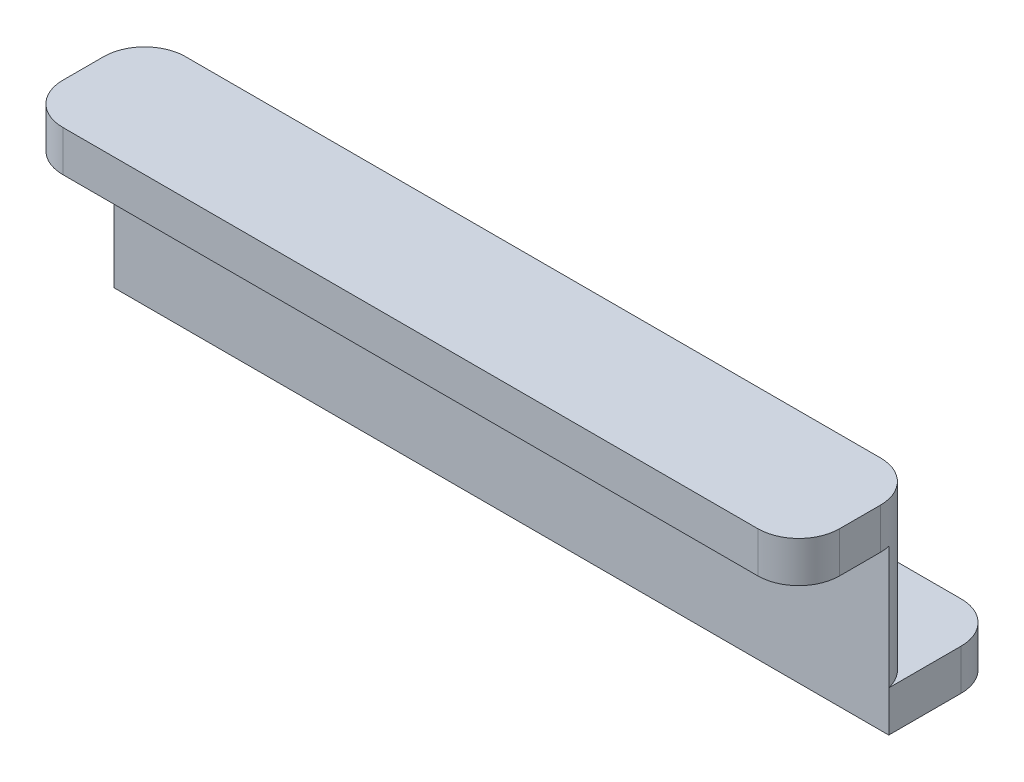
ISO-10303-21;
HEADER;
FILE_DESCRIPTION(('STEP AP214'),'2;1');
FILE_NAME('part.step','',(''),(''),'','','');
FILE_SCHEMA(('AUTOMOTIVE_DESIGN { 1 0 10303 214 1 1 1 1 }'));
ENDSEC;
DATA;
#1=APPLICATION_CONTEXT('core data for automotive mechanical design processes');
#2=APPLICATION_PROTOCOL_DEFINITION('international standard','automotive_design',2000,#1);
#3=PRODUCT_CONTEXT('',#1,'mechanical');
#4=PRODUCT('Part','Part','',(#3));
#5=PRODUCT_RELATED_PRODUCT_CATEGORY('part','',(#4));
#6=PRODUCT_DEFINITION_FORMATION('','',#4);
#7=PRODUCT_DEFINITION_CONTEXT('part definition',#1,'design');
#8=PRODUCT_DEFINITION('design','',#6,#7);
#9=PRODUCT_DEFINITION_SHAPE('','',#8);
#10=(LENGTH_UNIT() NAMED_UNIT(*) SI_UNIT(.MILLI.,.METRE.));
#11=(NAMED_UNIT(*) PLANE_ANGLE_UNIT() SI_UNIT($,.RADIAN.));
#12=(NAMED_UNIT(*) SI_UNIT($,.STERADIAN.) SOLID_ANGLE_UNIT());
#13=UNCERTAINTY_MEASURE_WITH_UNIT(LENGTH_MEASURE(1.E-05),#10,'distance_accuracy_value','');
#14=(GEOMETRIC_REPRESENTATION_CONTEXT(3) GLOBAL_UNCERTAINTY_ASSIGNED_CONTEXT((#13)) GLOBAL_UNIT_ASSIGNED_CONTEXT((#10,
#11,#12)) REPRESENTATION_CONTEXT('',''));
#15=CARTESIAN_POINT('',(0.,0.,0.));
#16=DIRECTION('',(0.,0.,1.));
#17=DIRECTION('',(1.,0.,0.));
#18=AXIS2_PLACEMENT_3D('',#15,#16,#17);
#19=CARTESIAN_POINT('',(17.,2.,-1.));
#20=DIRECTION('',(0.,-1.,0.));
#21=DIRECTION('',(0.,0.,-1.));
#22=AXIS2_PLACEMENT_3D('',#19,#20,#21);
#23=CYLINDRICAL_SURFACE('',#22,2.);
#24=CARTESIAN_POINT('',(17.0000000000001,-5.99999999999988,-1.00000000000002));
#25=DIRECTION('',(0.,1.,0.));
#26=DIRECTION('',(1.,0.,0.));
#27=AXIS2_PLACEMENT_3D('',#24,#25,#26);
#28=CIRCLE('',#27,2.);
#29=CARTESIAN_POINT('',(18.946893713898,-6.,-1.45782624082115));
#30=VERTEX_POINT('',#29);
#31=CARTESIAN_POINT('',(17.,-5.99999999999999,-3.00000000000001));
#32=VERTEX_POINT('',#31);
#33=EDGE_CURVE('E47',#30,#32,#28,.T.);
#34=ORIENTED_EDGE('',*,*,#33,.T.);
#35=DIRECTION('',(0.,-1.,0.));
#36=VECTOR('',#35,1.);
#37=CARTESIAN_POINT('',(17.,2.,-3.00000000000001));
#38=LINE('',#37,#36);
#39=CARTESIAN_POINT('',(17.,2.,-3.00000000000001));
#40=VERTEX_POINT('',#39);
#41=EDGE_CURVE('E40',#40,#32,#38,.T.);
#42=ORIENTED_EDGE('',*,*,#41,.F.);
#43=CARTESIAN_POINT('',(17.,2.,-1.));
#44=DIRECTION('',(0.,1.,0.));
#45=DIRECTION('',(0.,0.,-1.));
#46=AXIS2_PLACEMENT_3D('',#43,#44,#45);
#47=CIRCLE('',#46,2.);
#48=CARTESIAN_POINT('',(19.,2.,-1.));
#49=VERTEX_POINT('',#48);
#50=EDGE_CURVE('E205',#49,#40,#47,.T.);
#51=ORIENTED_EDGE('',*,*,#50,.F.);
#52=DIRECTION('',(0.,-1.,0.));
#53=VECTOR('',#52,1.);
#54=CARTESIAN_POINT('',(19.,2.,-1.));
#55=LINE('',#54,#53);
#56=CARTESIAN_POINT('',(19.,0.,-1.));
#57=VERTEX_POINT('',#56);
#58=EDGE_CURVE('E222',#49,#57,#55,.T.);
#59=ORIENTED_EDGE('',*,*,#58,.T.);
#60=CARTESIAN_POINT('',(17.,0.,-1.));
#61=DIRECTION('',(0.,1.,0.));
#62=DIRECTION('',(0.,0.,-1.));
#63=AXIS2_PLACEMENT_3D('',#60,#61,#62);
#64=CIRCLE('',#63,2.);
#65=CARTESIAN_POINT('',(18.946893713898,0.,-1.45782624082115));
#66=VERTEX_POINT('',#65);
#67=EDGE_CURVE('E202',#57,#66,#64,.T.);
#68=ORIENTED_EDGE('',*,*,#67,.T.);
#69=DIRECTION('',(0.,1.,0.));
#70=VECTOR('',#69,1.);
#71=CARTESIAN_POINT('',(18.946893713898,-8.,-1.45782624082115));
#72=LINE('',#71,#70);
#73=EDGE_CURVE('E203',#30,#66,#72,.T.);
#74=ORIENTED_EDGE('',*,*,#73,.F.);
#75=EDGE_LOOP('',(#34,#42,#51,#59,#68,#74));
#76=FACE_BOUND('',#75,.T.);
#77=ADVANCED_FACE('F33',(#76),#23,.T.);
#78=CARTESIAN_POINT('',(-17.,2.,-3.));
#79=DIRECTION('',(0.,0.,1.));
#80=DIRECTION('',(1.,0.,0.));
#81=AXIS2_PLACEMENT_3D('',#78,#79,#80);
#82=PLANE('',#81);
#83=DIRECTION('',(-1.,0.,0.));
#84=VECTOR('',#83,1.);
#85=CARTESIAN_POINT('',(17.0000000000001,-5.99999999999987,-3.00000000000002));
#86=LINE('',#85,#84);
#87=CARTESIAN_POINT('',(-17.,-6.0000000000001,-3.));
#88=VERTEX_POINT('',#87);
#89=EDGE_CURVE('E54',#32,#88,#86,.T.);
#90=ORIENTED_EDGE('',*,*,#89,.T.);
#91=DIRECTION('',(0.,-1.,0.));
#92=VECTOR('',#91,1.);
#93=CARTESIAN_POINT('',(-17.,2.,-3.));
#94=LINE('',#93,#92);
#95=CARTESIAN_POINT('',(-17.,2.,-3.));
#96=VERTEX_POINT('',#95);
#97=EDGE_CURVE('E253',#96,#88,#94,.T.);
#98=ORIENTED_EDGE('',*,*,#97,.F.);
#99=DIRECTION('',(-1.,0.,0.));
#100=VECTOR('',#99,1.);
#101=CARTESIAN_POINT('',(-17.,2.,-3.));
#102=LINE('',#101,#100);
#103=EDGE_CURVE('E207',#40,#96,#102,.T.);
#104=ORIENTED_EDGE('',*,*,#103,.F.);
#105=ORIENTED_EDGE('',*,*,#41,.T.);
#106=EDGE_LOOP('',(#90,#98,#104,#105));
#107=FACE_BOUND('',#106,.T.);
#108=ADVANCED_FACE('F255',(#107),#82,.F.);
#109=CARTESIAN_POINT('',(-17.,2.,-1.));
#110=DIRECTION('',(0.,-1.,0.));
#111=DIRECTION('',(0.,0.,-1.));
#112=AXIS2_PLACEMENT_3D('',#109,#110,#111);
#113=CYLINDRICAL_SURFACE('',#112,2.);
#114=CARTESIAN_POINT('',(-16.9999999999999,-6.00000000000012,-1.00000000000002));
#115=DIRECTION('',(0.,1.,0.));
#116=DIRECTION('',(1.,0.,0.));
#117=AXIS2_PLACEMENT_3D('',#114,#115,#116);
#118=CIRCLE('',#117,2.00000000000001);
#119=CARTESIAN_POINT('',(-18.946893713898,-6.,-1.45782624082114));
#120=VERTEX_POINT('',#119);
#121=EDGE_CURVE('E166',#88,#120,#118,.T.);
#122=ORIENTED_EDGE('',*,*,#121,.T.);
#123=DIRECTION('',(0.,1.,0.));
#124=VECTOR('',#123,1.);
#125=CARTESIAN_POINT('',(-18.946893713898,-8.,-1.45782624082114));
#126=LINE('',#125,#124);
#127=CARTESIAN_POINT('',(-18.946893713898,0.,-1.45782624082114));
#128=VERTEX_POINT('',#127);
#129=EDGE_CURVE('E198',#120,#128,#126,.T.);
#130=ORIENTED_EDGE('',*,*,#129,.T.);
#131=CARTESIAN_POINT('',(-17.,0.,-1.));
#132=DIRECTION('',(0.,1.,0.));
#133=DIRECTION('',(0.,0.,-1.));
#134=AXIS2_PLACEMENT_3D('',#131,#132,#133);
#135=CIRCLE('',#134,2.);
#136=CARTESIAN_POINT('',(-19.,0.,-1.));
#137=VERTEX_POINT('',#136);
#138=EDGE_CURVE('E225',#128,#137,#135,.T.);
#139=ORIENTED_EDGE('',*,*,#138,.T.);
#140=DIRECTION('',(0.,-1.,0.));
#141=VECTOR('',#140,1.);
#142=CARTESIAN_POINT('',(-19.,2.,-1.));
#143=LINE('',#142,#141);
#144=CARTESIAN_POINT('',(-19.,2.,-1.));
#145=VERTEX_POINT('',#144);
#146=EDGE_CURVE('E250',#145,#137,#143,.T.);
#147=ORIENTED_EDGE('',*,*,#146,.F.);
#148=CARTESIAN_POINT('',(-17.,2.,-1.));
#149=DIRECTION('',(0.,1.,0.));
#150=DIRECTION('',(0.,0.,-1.));
#151=AXIS2_PLACEMENT_3D('',#148,#149,#150);
#152=CIRCLE('',#151,2.);
#153=EDGE_CURVE('E210',#96,#145,#152,.T.);
#154=ORIENTED_EDGE('',*,*,#153,.F.);
#155=ORIENTED_EDGE('',*,*,#97,.T.);
#156=EDGE_LOOP('',(#122,#130,#139,#147,#154,#155));
#157=FACE_BOUND('',#156,.T.);
#158=ADVANCED_FACE('F260',(#157),#113,.T.);
#159=CARTESIAN_POINT('',(-19.,2.,1.));
#160=DIRECTION('',(1.,0.,0.));
#161=DIRECTION('',(0.,0.,-1.));
#162=AXIS2_PLACEMENT_3D('',#159,#160,#161);
#163=PLANE('',#162);
#164=DIRECTION('',(0.,0.,1.));
#165=VECTOR('',#164,1.);
#166=CARTESIAN_POINT('',(-19.,0.,1.));
#167=LINE('',#166,#165);
#168=CARTESIAN_POINT('',(-19.,0.,1.));
#169=VERTEX_POINT('',#168);
#170=EDGE_CURVE('E227',#137,#169,#167,.T.);
#171=ORIENTED_EDGE('',*,*,#170,.T.);
#172=DIRECTION('',(0.,-1.,0.));
#173=VECTOR('',#172,1.);
#174=CARTESIAN_POINT('',(-19.,2.,1.));
#175=LINE('',#174,#173);
#176=CARTESIAN_POINT('',(-19.,2.,1.));
#177=VERTEX_POINT('',#176);
#178=EDGE_CURVE('E247',#177,#169,#175,.T.);
#179=ORIENTED_EDGE('',*,*,#178,.F.);
#180=DIRECTION('',(0.,0.,1.));
#181=VECTOR('',#180,1.);
#182=CARTESIAN_POINT('',(-19.,2.,1.));
#183=LINE('',#182,#181);
#184=EDGE_CURVE('E212',#145,#177,#183,.T.);
#185=ORIENTED_EDGE('',*,*,#184,.F.);
#186=ORIENTED_EDGE('',*,*,#146,.T.);
#187=EDGE_LOOP('',(#171,#179,#185,#186));
#188=FACE_BOUND('',#187,.T.);
#189=ADVANCED_FACE('F293',(#188),#163,.F.);
#190=CARTESIAN_POINT('',(-17.,2.,1.));
#191=DIRECTION('',(0.,-1.,0.));
#192=DIRECTION('',(0.,0.,-1.));
#193=AXIS2_PLACEMENT_3D('',#190,#191,#192);
#194=CYLINDRICAL_SURFACE('',#193,2.);
#195=CARTESIAN_POINT('',(-17.,0.,1.));
#196=DIRECTION('',(0.,1.,0.));
#197=DIRECTION('',(0.,0.,-1.));
#198=AXIS2_PLACEMENT_3D('',#195,#196,#197);
#199=CIRCLE('',#198,2.);
#200=CARTESIAN_POINT('',(-17.,0.,3.));
#201=VERTEX_POINT('',#200);
#202=EDGE_CURVE('E229',#169,#201,#199,.T.);
#203=ORIENTED_EDGE('',*,*,#202,.T.);
#204=DIRECTION('',(0.,-1.,0.));
#205=VECTOR('',#204,1.);
#206=CARTESIAN_POINT('',(-17.,2.,3.));
#207=LINE('',#206,#205);
#208=CARTESIAN_POINT('',(-17.,2.,3.));
#209=VERTEX_POINT('',#208);
#210=EDGE_CURVE('E244',#209,#201,#207,.T.);
#211=ORIENTED_EDGE('',*,*,#210,.F.);
#212=CARTESIAN_POINT('',(-17.,2.,1.));
#213=DIRECTION('',(0.,1.,0.));
#214=DIRECTION('',(0.,0.,-1.));
#215=AXIS2_PLACEMENT_3D('',#212,#213,#214);
#216=CIRCLE('',#215,2.);
#217=EDGE_CURVE('E214',#177,#209,#216,.T.);
#218=ORIENTED_EDGE('',*,*,#217,.F.);
#219=ORIENTED_EDGE('',*,*,#178,.T.);
#220=EDGE_LOOP('',(#203,#211,#218,#219));
#221=FACE_BOUND('',#220,.T.);
#222=ADVANCED_FACE('F290',(#221),#194,.T.);
#223=CARTESIAN_POINT('',(-17.,2.,3.));
#224=DIRECTION('',(0.,0.,-1.));
#225=DIRECTION('',(-1.,0.,0.));
#226=AXIS2_PLACEMENT_3D('',#223,#224,#225);
#227=PLANE('',#226);
#228=DIRECTION('',(1.,0.,0.));
#229=VECTOR('',#228,1.);
#230=CARTESIAN_POINT('',(-17.,0.,3.));
#231=LINE('',#230,#229);
#232=CARTESIAN_POINT('',(17.,0.,2.99999999999999));
#233=VERTEX_POINT('',#232);
#234=EDGE_CURVE('E231',#201,#233,#231,.T.);
#235=ORIENTED_EDGE('',*,*,#234,.T.);
#236=DIRECTION('',(0.,-1.,0.));
#237=VECTOR('',#236,1.);
#238=CARTESIAN_POINT('',(17.,2.,2.99999999999999));
#239=LINE('',#238,#237);
#240=CARTESIAN_POINT('',(17.,2.,2.99999999999999));
#241=VERTEX_POINT('',#240);
#242=EDGE_CURVE('E241',#241,#233,#239,.T.);
#243=ORIENTED_EDGE('',*,*,#242,.F.);
#244=DIRECTION('',(1.,0.,0.));
#245=VECTOR('',#244,1.);
#246=CARTESIAN_POINT('',(-17.,2.,3.));
#247=LINE('',#246,#245);
#248=EDGE_CURVE('E216',#209,#241,#247,.T.);
#249=ORIENTED_EDGE('',*,*,#248,.F.);
#250=ORIENTED_EDGE('',*,*,#210,.T.);
#251=EDGE_LOOP('',(#235,#243,#249,#250));
#252=FACE_BOUND('',#251,.T.);
#253=ADVANCED_FACE('F286',(#252),#227,.F.);
#254=CARTESIAN_POINT('',(17.,2.,0.999999999999994));
#255=DIRECTION('',(0.,-1.,0.));
#256=DIRECTION('',(0.,0.,-1.));
#257=AXIS2_PLACEMENT_3D('',#254,#255,#256);
#258=CYLINDRICAL_SURFACE('',#257,2.);
#259=CARTESIAN_POINT('',(17.,0.,0.999999999999994));
#260=DIRECTION('',(0.,1.,0.));
#261=DIRECTION('',(0.,0.,1.));
#262=AXIS2_PLACEMENT_3D('',#259,#260,#261);
#263=CIRCLE('',#262,2.);
#264=CARTESIAN_POINT('',(19.,0.,0.999999999999993));
#265=VERTEX_POINT('',#264);
#266=EDGE_CURVE('E233',#233,#265,#263,.T.);
#267=ORIENTED_EDGE('',*,*,#266,.T.);
#268=DIRECTION('',(0.,-1.,0.));
#269=VECTOR('',#268,1.);
#270=CARTESIAN_POINT('',(19.,2.,0.999999999999993));
#271=LINE('',#270,#269);
#272=CARTESIAN_POINT('',(19.,2.,0.999999999999993));
#273=VERTEX_POINT('',#272);
#274=EDGE_CURVE('E238',#273,#265,#271,.T.);
#275=ORIENTED_EDGE('',*,*,#274,.F.);
#276=CARTESIAN_POINT('',(17.,2.,0.999999999999994));
#277=DIRECTION('',(0.,1.,0.));
#278=DIRECTION('',(0.,0.,1.));
#279=AXIS2_PLACEMENT_3D('',#276,#277,#278);
#280=CIRCLE('',#279,2.);
#281=EDGE_CURVE('E218',#241,#273,#280,.T.);
#282=ORIENTED_EDGE('',*,*,#281,.F.);
#283=ORIENTED_EDGE('',*,*,#242,.T.);
#284=EDGE_LOOP('',(#267,#275,#282,#283));
#285=FACE_BOUND('',#284,.T.);
#286=ADVANCED_FACE('F281',(#285),#258,.T.);
#287=CARTESIAN_POINT('',(19.,2.,0.999999999999993));
#288=DIRECTION('',(-1.,0.,0.));
#289=DIRECTION('',(0.,0.,1.));
#290=AXIS2_PLACEMENT_3D('',#287,#288,#289);
#291=PLANE('',#290);
#292=DIRECTION('',(0.,0.,-1.));
#293=VECTOR('',#292,1.);
#294=CARTESIAN_POINT('',(19.,0.,0.999999999999993));
#295=LINE('',#294,#293);
#296=EDGE_CURVE('E208',#265,#57,#295,.T.);
#297=ORIENTED_EDGE('',*,*,#296,.T.);
#298=ORIENTED_EDGE('',*,*,#58,.F.);
#299=DIRECTION('',(0.,0.,-1.));
#300=VECTOR('',#299,1.);
#301=CARTESIAN_POINT('',(19.,2.,0.999999999999993));
#302=LINE('',#301,#300);
#303=EDGE_CURVE('E220',#273,#49,#302,.T.);
#304=ORIENTED_EDGE('',*,*,#303,.F.);
#305=ORIENTED_EDGE('',*,*,#274,.T.);
#306=EDGE_LOOP('',(#297,#298,#304,#305));
#307=FACE_BOUND('',#306,.T.);
#308=ADVANCED_FACE('F275',(#307),#291,.F.);
#309=CARTESIAN_POINT('',(17.,2.,-1.));
#310=DIRECTION('',(0.,-1.,0.));
#311=DIRECTION('',(0.,0.,-1.));
#312=AXIS2_PLACEMENT_3D('',#309,#310,#311);
#313=PLANE('',#312);
#314=ORIENTED_EDGE('',*,*,#50,.T.);
#315=ORIENTED_EDGE('',*,*,#103,.T.);
#316=ORIENTED_EDGE('',*,*,#153,.T.);
#317=ORIENTED_EDGE('',*,*,#184,.T.);
#318=ORIENTED_EDGE('',*,*,#217,.T.);
#319=ORIENTED_EDGE('',*,*,#248,.T.);
#320=ORIENTED_EDGE('',*,*,#281,.T.);
#321=ORIENTED_EDGE('',*,*,#303,.T.);
#322=EDGE_LOOP('',(#314,#315,#316,#317,#318,#319,#320,#321));
#323=FACE_BOUND('',#322,.T.);
#324=ADVANCED_FACE('F297',(#323),#313,.F.);
#325=CARTESIAN_POINT('',(17.,0.,-1.));
#326=DIRECTION('',(0.,-1.,0.));
#327=DIRECTION('',(0.,0.,-1.));
#328=AXIS2_PLACEMENT_3D('',#325,#326,#327);
#329=PLANE('',#328);
#330=DIRECTION('',(-1.,0.,0.));
#331=VECTOR('',#330,1.);
#332=CARTESIAN_POINT('',(17.,0.,-1.45782624082115));
#333=LINE('',#332,#331);
#334=EDGE_CURVE('E11',#66,#128,#333,.T.);
#335=ORIENTED_EDGE('',*,*,#334,.F.);
#336=ORIENTED_EDGE('',*,*,#67,.F.);
#337=ORIENTED_EDGE('',*,*,#296,.F.);
#338=ORIENTED_EDGE('',*,*,#266,.F.);
#339=ORIENTED_EDGE('',*,*,#234,.F.);
#340=ORIENTED_EDGE('',*,*,#202,.F.);
#341=ORIENTED_EDGE('',*,*,#170,.F.);
#342=ORIENTED_EDGE('',*,*,#138,.F.);
#343=EDGE_LOOP('',(#335,#336,#337,#338,#339,#340,#341,#342));
#344=FACE_BOUND('',#343,.T.);
#345=ADVANCED_FACE('F269',(#344),#329,.T.);
#346=CARTESIAN_POINT('',(18.946893713898,-8.,-1.45782624082115));
#347=DIRECTION('',(0.,0.,1.));
#348=DIRECTION('',(1.,0.,0.));
#349=AXIS2_PLACEMENT_3D('',#346,#347,#348);
#350=PLANE('',#349);
#351=CARTESIAN_POINT('',(18.946893713898,-8.,-1.45782624082115));
#352=VERTEX_POINT('',#351);
#353=EDGE_CURVE('E199',#352,#30,#72,.T.);
#354=ORIENTED_EDGE('',*,*,#353,.T.);
#355=ORIENTED_EDGE('',*,*,#73,.T.);
#356=ORIENTED_EDGE('',*,*,#334,.T.);
#357=ORIENTED_EDGE('',*,*,#129,.F.);
#358=CARTESIAN_POINT('',(-18.946893713898,-8.,-1.45782624082114));
#359=VERTEX_POINT('',#358);
#360=EDGE_CURVE('E165',#359,#120,#126,.T.);
#361=ORIENTED_EDGE('',*,*,#360,.F.);
#362=DIRECTION('',(1.,0.,0.));
#363=VECTOR('',#362,1.);
#364=CARTESIAN_POINT('',(18.946893713898,-8.,-1.45782624082115));
#365=LINE('',#364,#363);
#366=EDGE_CURVE('E193',#359,#352,#365,.T.);
#367=ORIENTED_EDGE('',*,*,#366,.T.);
#368=EDGE_LOOP('',(#354,#355,#356,#357,#361,#367));
#369=FACE_BOUND('',#368,.T.);
#370=ADVANCED_FACE('F264',(#369),#350,.T.);
#371=CARTESIAN_POINT('',(-17.,-8.,-1.));
#372=DIRECTION('',(0.,1.,0.));
#373=DIRECTION('',(0.,0.,1.));
#374=AXIS2_PLACEMENT_3D('',#371,#372,#373);
#375=PLANE('',#374);
#376=ORIENTED_EDGE('',*,*,#366,.F.);
#377=DIRECTION('',(0.,0.,-1.));
#378=VECTOR('',#377,1.);
#379=CARTESIAN_POINT('',(-18.9468937138979,-8.00000000000013,-1.45782624082116));
#380=LINE('',#379,#378);
#381=CARTESIAN_POINT('',(-18.9468937138979,-8.00000000000012,-5.00000000000002));
#382=VERTEX_POINT('',#381);
#383=EDGE_CURVE('E180',#359,#382,#380,.T.);
#384=ORIENTED_EDGE('',*,*,#383,.T.);
#385=CARTESIAN_POINT('',(-16.946893713898,-8.00000000000011,-5.00000000000002));
#386=DIRECTION('',(0.,-1.,0.));
#387=DIRECTION('',(1.,0.,0.));
#388=AXIS2_PLACEMENT_3D('',#385,#386,#387);
#389=CIRCLE('',#388,2.);
#390=CARTESIAN_POINT('',(-16.946893713898,-8.0000000000001,-7.00000000000002));
#391=VERTEX_POINT('',#390);
#392=EDGE_CURVE('E146',#382,#391,#389,.T.);
#393=ORIENTED_EDGE('',*,*,#392,.T.);
#394=DIRECTION('',(1.,0.,0.));
#395=VECTOR('',#394,1.);
#396=CARTESIAN_POINT('',(-16.946893713898,-8.0000000000001,-7.00000000000002));
#397=LINE('',#396,#395);
#398=CARTESIAN_POINT('',(16.9468937138981,-7.99999999999986,-7.00000000000002));
#399=VERTEX_POINT('',#398);
#400=EDGE_CURVE('E183',#391,#399,#397,.T.);
#401=ORIENTED_EDGE('',*,*,#400,.T.);
#402=CARTESIAN_POINT('',(16.9468937138981,-7.99999999999987,-5.00000000000002));
#403=DIRECTION('',(0.,-1.,0.));
#404=DIRECTION('',(1.,0.,0.));
#405=AXIS2_PLACEMENT_3D('',#402,#403,#404);
#406=CIRCLE('',#405,2.);
#407=CARTESIAN_POINT('',(18.9468937138981,-7.99999999999986,-5.00000000000002));
#408=VERTEX_POINT('',#407);
#409=EDGE_CURVE('E186',#399,#408,#406,.T.);
#410=ORIENTED_EDGE('',*,*,#409,.T.);
#411=DIRECTION('',(0.,0.,1.));
#412=VECTOR('',#411,1.);
#413=CARTESIAN_POINT('',(18.9468937138981,-7.99999999999986,-5.00000000000002));
#414=LINE('',#413,#412);
#415=EDGE_CURVE('E168',#408,#352,#414,.T.);
#416=ORIENTED_EDGE('',*,*,#415,.T.);
#417=EDGE_LOOP('',(#376,#384,#393,#401,#410,#416));
#418=FACE_BOUND('',#417,.T.);
#419=ADVANCED_FACE('F368',(#418),#375,.F.);
#420=CARTESIAN_POINT('',(18.9468937138981,-5.99999999999986,-5.00000000000002));
#421=DIRECTION('',(1.,0.,0.));
#422=DIRECTION('',(0.,1.,0.));
#423=AXIS2_PLACEMENT_3D('',#420,#421,#422);
#424=PLANE('',#423);
#425=ORIENTED_EDGE('',*,*,#415,.F.);
#426=DIRECTION('',(0.,-1.,0.));
#427=VECTOR('',#426,1.);
#428=CARTESIAN_POINT('',(18.9468937138981,-5.99999999999986,-5.00000000000002));
#429=LINE('',#428,#427);
#430=CARTESIAN_POINT('',(18.9468937138981,-5.99999999999986,-5.00000000000002));
#431=VERTEX_POINT('',#430);
#432=EDGE_CURVE('E191',#431,#408,#429,.T.);
#433=ORIENTED_EDGE('',*,*,#432,.F.);
#434=DIRECTION('',(0.,0.,1.));
#435=VECTOR('',#434,1.);
#436=CARTESIAN_POINT('',(18.9468937138981,-5.99999999999986,-5.00000000000002));
#437=LINE('',#436,#435);
#438=EDGE_CURVE('E175',#431,#30,#437,.T.);
#439=ORIENTED_EDGE('',*,*,#438,.T.);
#440=ORIENTED_EDGE('',*,*,#353,.F.);
#441=EDGE_LOOP('',(#425,#433,#439,#440));
#442=FACE_BOUND('',#441,.T.);
#443=ADVANCED_FACE('F376',(#442),#424,.T.);
#444=CARTESIAN_POINT('',(16.946893713898,-5.99999999999987,-5.00000000000002));
#445=DIRECTION('',(0.,-1.,0.));
#446=DIRECTION('',(1.,0.,0.));
#447=AXIS2_PLACEMENT_3D('',#444,#445,#446);
#448=CYLINDRICAL_SURFACE('',#447,2.);
#449=ORIENTED_EDGE('',*,*,#409,.F.);
#450=DIRECTION('',(0.,-1.,0.));
#451=VECTOR('',#450,1.);
#452=CARTESIAN_POINT('',(16.946893713898,-5.99999999999986,-7.00000000000002));
#453=LINE('',#452,#451);
#454=CARTESIAN_POINT('',(16.946893713898,-5.99999999999986,-7.00000000000002));
#455=VERTEX_POINT('',#454);
#456=EDGE_CURVE('E194',#455,#399,#453,.T.);
#457=ORIENTED_EDGE('',*,*,#456,.F.);
#458=CARTESIAN_POINT('',(16.946893713898,-5.99999999999987,-5.00000000000002));
#459=DIRECTION('',(0.,-1.,0.));
#460=DIRECTION('',(1.,0.,0.));
#461=AXIS2_PLACEMENT_3D('',#458,#459,#460);
#462=CIRCLE('',#461,2.);
#463=EDGE_CURVE('E172',#455,#431,#462,.T.);
#464=ORIENTED_EDGE('',*,*,#463,.T.);
#465=ORIENTED_EDGE('',*,*,#432,.T.);
#466=EDGE_LOOP('',(#449,#457,#464,#465));
#467=FACE_BOUND('',#466,.T.);
#468=ADVANCED_FACE('F386',(#467),#448,.T.);
#469=CARTESIAN_POINT('',(-16.946893713898,-6.0000000000001,-7.00000000000002));
#470=DIRECTION('',(0.,0.,-1.));
#471=DIRECTION('',(0.,1.,0.));
#472=AXIS2_PLACEMENT_3D('',#469,#470,#471);
#473=PLANE('',#472);
#474=ORIENTED_EDGE('',*,*,#400,.F.);
#475=DIRECTION('',(0.,-1.,0.));
#476=VECTOR('',#475,1.);
#477=CARTESIAN_POINT('',(-16.946893713898,-6.0000000000001,-7.00000000000002));
#478=LINE('',#477,#476);
#479=CARTESIAN_POINT('',(-16.946893713898,-6.0000000000001,-7.00000000000002));
#480=VERTEX_POINT('',#479);
#481=EDGE_CURVE('E151',#480,#391,#478,.T.);
#482=ORIENTED_EDGE('',*,*,#481,.F.);
#483=DIRECTION('',(1.,0.,0.));
#484=VECTOR('',#483,1.);
#485=CARTESIAN_POINT('',(-16.946893713898,-6.0000000000001,-7.00000000000002));
#486=LINE('',#485,#484);
#487=EDGE_CURVE('E161',#480,#455,#486,.T.);
#488=ORIENTED_EDGE('',*,*,#487,.T.);
#489=ORIENTED_EDGE('',*,*,#456,.T.);
#490=EDGE_LOOP('',(#474,#482,#488,#489));
#491=FACE_BOUND('',#490,.T.);
#492=ADVANCED_FACE('F396',(#491),#473,.T.);
#493=CARTESIAN_POINT('',(-16.946893713898,-6.00000000000011,-5.00000000000002));
#494=DIRECTION('',(0.,-1.,0.));
#495=DIRECTION('',(1.,0.,0.));
#496=AXIS2_PLACEMENT_3D('',#493,#494,#495);
#497=CYLINDRICAL_SURFACE('',#496,2.);
#498=ORIENTED_EDGE('',*,*,#392,.F.);
#499=DIRECTION('',(0.,-1.,0.));
#500=VECTOR('',#499,1.);
#501=CARTESIAN_POINT('',(-18.946893713898,-6.00000000000012,-5.00000000000002));
#502=LINE('',#501,#500);
#503=CARTESIAN_POINT('',(-18.946893713898,-6.00000000000012,-5.00000000000002));
#504=VERTEX_POINT('',#503);
#505=EDGE_CURVE('E141',#504,#382,#502,.T.);
#506=ORIENTED_EDGE('',*,*,#505,.F.);
#507=CARTESIAN_POINT('',(-16.946893713898,-6.00000000000011,-5.00000000000002));
#508=DIRECTION('',(0.,-1.,0.));
#509=DIRECTION('',(1.,0.,0.));
#510=AXIS2_PLACEMENT_3D('',#507,#508,#509);
#511=CIRCLE('',#510,2.);
#512=EDGE_CURVE('E144',#504,#480,#511,.T.);
#513=ORIENTED_EDGE('',*,*,#512,.T.);
#514=ORIENTED_EDGE('',*,*,#481,.T.);
#515=EDGE_LOOP('',(#498,#506,#513,#514));
#516=FACE_BOUND('',#515,.T.);
#517=ADVANCED_FACE('F143',(#516),#497,.T.);
#518=CARTESIAN_POINT('',(-18.946893713898,-6.00000000000013,-1.45782624082116));
#519=DIRECTION('',(-1.,0.,0.));
#520=DIRECTION('',(0.,-1.,0.));
#521=AXIS2_PLACEMENT_3D('',#518,#519,#520);
#522=PLANE('',#521);
#523=ORIENTED_EDGE('',*,*,#383,.F.);
#524=ORIENTED_EDGE('',*,*,#360,.T.);
#525=DIRECTION('',(0.,0.,-1.));
#526=VECTOR('',#525,1.);
#527=CARTESIAN_POINT('',(-18.946893713898,-6.00000000000013,-1.45782624082116));
#528=LINE('',#527,#526);
#529=EDGE_CURVE('E158',#120,#504,#528,.T.);
#530=ORIENTED_EDGE('',*,*,#529,.T.);
#531=ORIENTED_EDGE('',*,*,#505,.T.);
#532=EDGE_LOOP('',(#523,#524,#530,#531));
#533=FACE_BOUND('',#532,.T.);
#534=ADVANCED_FACE('F164',(#533),#522,.T.);
#535=CARTESIAN_POINT('',(-16.9999999999999,-6.00000000000012,-1.00000000000002));
#536=DIRECTION('',(0.,-1.,0.));
#537=DIRECTION('',(1.,0.,0.));
#538=AXIS2_PLACEMENT_3D('',#535,#536,#537);
#539=PLANE('',#538);
#540=ORIENTED_EDGE('',*,*,#121,.F.);
#541=ORIENTED_EDGE('',*,*,#89,.F.);
#542=ORIENTED_EDGE('',*,*,#33,.F.);
#543=ORIENTED_EDGE('',*,*,#438,.F.);
#544=ORIENTED_EDGE('',*,*,#463,.F.);
#545=ORIENTED_EDGE('',*,*,#487,.F.);
#546=ORIENTED_EDGE('',*,*,#512,.F.);
#547=ORIENTED_EDGE('',*,*,#529,.F.);
#548=EDGE_LOOP('',(#540,#541,#542,#543,#544,#545,#546,#547));
#549=FACE_BOUND('',#548,.T.);
#550=ADVANCED_FACE('F157',(#549),#539,.F.);
#551=CLOSED_SHELL('',(#77,#108,#158,#189,#222,#253,#286,#308,#324,#345,#370,#419,#443,#468,#492,
#517,#534,#550));
#552=MANIFOLD_SOLID_BREP('B2',#551);
#553=ADVANCED_BREP_SHAPE_REPRESENTATION('',(#18,#552),#14);
#554=SHAPE_DEFINITION_REPRESENTATION(#9,#553);
ENDSEC;
END-ISO-10303-21;
